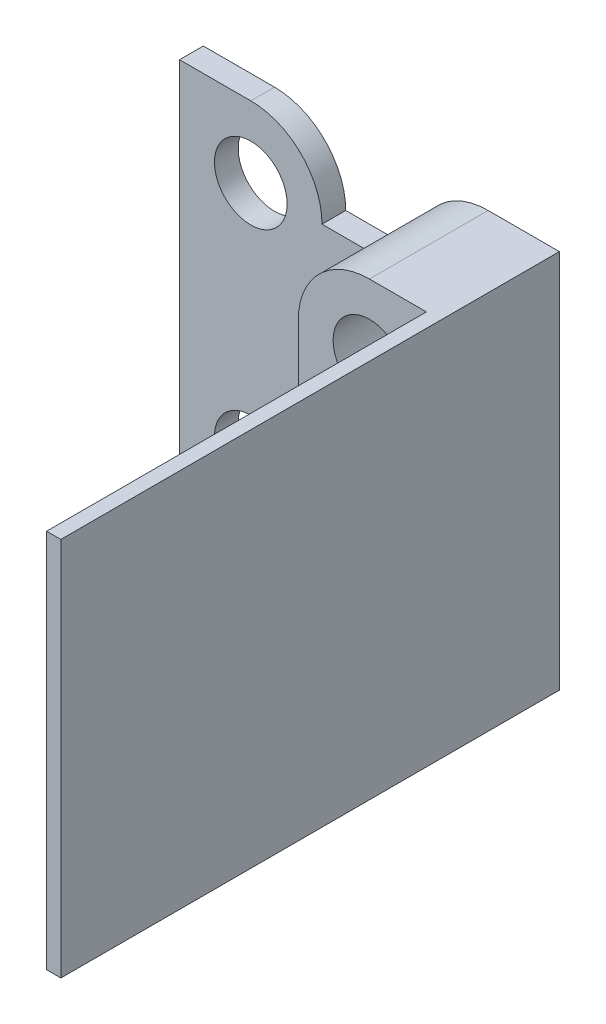
ISO-10303-21;
HEADER;
FILE_DESCRIPTION(('STEP AP214'),'2;1');
FILE_NAME('part.step','',(''),(''),'','','');
FILE_SCHEMA(('AUTOMOTIVE_DESIGN { 1 0 10303 214 1 1 1 1 }'));
ENDSEC;
DATA;
#1=APPLICATION_CONTEXT('core data for automotive mechanical design processes');
#2=APPLICATION_PROTOCOL_DEFINITION('international standard','automotive_design',2000,#1);
#3=PRODUCT_CONTEXT('',#1,'mechanical');
#4=PRODUCT('Part','Part','',(#3));
#5=PRODUCT_RELATED_PRODUCT_CATEGORY('part','',(#4));
#6=PRODUCT_DEFINITION_FORMATION('','',#4);
#7=PRODUCT_DEFINITION_CONTEXT('part definition',#1,'design');
#8=PRODUCT_DEFINITION('design','',#6,#7);
#9=PRODUCT_DEFINITION_SHAPE('','',#8);
#10=(LENGTH_UNIT() NAMED_UNIT(*) SI_UNIT(.MILLI.,.METRE.));
#11=(NAMED_UNIT(*) PLANE_ANGLE_UNIT() SI_UNIT($,.RADIAN.));
#12=(NAMED_UNIT(*) SI_UNIT($,.STERADIAN.) SOLID_ANGLE_UNIT());
#13=UNCERTAINTY_MEASURE_WITH_UNIT(LENGTH_MEASURE(1.E-05),#10,'distance_accuracy_value','');
#14=(GEOMETRIC_REPRESENTATION_CONTEXT(3) GLOBAL_UNCERTAINTY_ASSIGNED_CONTEXT((#13)) GLOBAL_UNIT_ASSIGNED_CONTEXT((#10,
#11,#12)) REPRESENTATION_CONTEXT('',''));
#15=CARTESIAN_POINT('',(0.,0.,0.));
#16=DIRECTION('',(0.,0.,1.));
#17=DIRECTION('',(1.,0.,0.));
#18=AXIS2_PLACEMENT_3D('',#15,#16,#17);
#19=CARTESIAN_POINT('',(45.,50.,5.));
#20=DIRECTION('',(0.,0.,1.));
#21=DIRECTION('',(1.,0.,0.));
#22=AXIS2_PLACEMENT_3D('',#19,#20,#21);
#23=PLANE('',#22);
#24=CARTESIAN_POINT('',(0.,50.,5.));
#25=DIRECTION('',(0.,0.,1.));
#26=DIRECTION('',(1.,0.,0.));
#27=AXIS2_PLACEMENT_3D('',#24,#25,#26);
#28=CIRCLE('',#27,7.65);
#29=CARTESIAN_POINT('',(7.65,50.,5.));
#30=VERTEX_POINT('',#29);
#31=EDGE_CURVE('E172',#30,#30,#28,.T.);
#32=ORIENTED_EDGE('',*,*,#31,.F.);
#33=EDGE_LOOP('',(#32));
#34=FACE_BOUND('',#33,.T.);
#35=CARTESIAN_POINT('',(0.,0.,5.));
#36=DIRECTION('',(0.,0.,1.));
#37=DIRECTION('',(1.,0.,0.));
#38=AXIS2_PLACEMENT_3D('',#35,#36,#37);
#39=CIRCLE('',#38,7.65);
#40=CARTESIAN_POINT('',(7.65,0.,5.));
#41=VERTEX_POINT('',#40);
#42=EDGE_CURVE('E181',#41,#41,#39,.T.);
#43=ORIENTED_EDGE('',*,*,#42,.F.);
#44=EDGE_LOOP('',(#43));
#45=FACE_BOUND('',#44,.T.);
#46=DIRECTION('',(1.,0.,0.));
#47=VECTOR('',#46,1.);
#48=CARTESIAN_POINT('',(30.,35.,5.));
#49=LINE('',#48,#47);
#50=CARTESIAN_POINT('',(30.,35.,5.));
#51=VERTEX_POINT('',#50);
#52=CARTESIAN_POINT('',(57.,35.,5.));
#53=VERTEX_POINT('',#52);
#54=EDGE_CURVE('E48',#51,#53,#49,.T.);
#55=ORIENTED_EDGE('',*,*,#54,.F.);
#56=DIRECTION('',(0.,-1.,0.));
#57=VECTOR('',#56,1.);
#58=CARTESIAN_POINT('',(30.,50.,5.));
#59=LINE('',#58,#57);
#60=CARTESIAN_POINT('',(30.,50.,5.));
#61=VERTEX_POINT('',#60);
#62=EDGE_CURVE('E255',#61,#51,#59,.T.);
#63=ORIENTED_EDGE('',*,*,#62,.F.);
#64=DIRECTION('',(-1.,0.,0.));
#65=VECTOR('',#64,1.);
#66=CARTESIAN_POINT('',(15.,50.,5.));
#67=LINE('',#66,#65);
#68=CARTESIAN_POINT('',(15.,50.,5.));
#69=VERTEX_POINT('',#68);
#70=EDGE_CURVE('E187',#61,#69,#67,.T.);
#71=ORIENTED_EDGE('',*,*,#70,.T.);
#72=CARTESIAN_POINT('',(0.,50.,5.));
#73=DIRECTION('',(0.,0.,1.));
#74=DIRECTION('',(-1.,0.,0.));
#75=AXIS2_PLACEMENT_3D('',#72,#73,#74);
#76=CIRCLE('',#75,15.);
#77=CARTESIAN_POINT('',(0.,65.,5.));
#78=VERTEX_POINT('',#77);
#79=EDGE_CURVE('E189',#69,#78,#76,.T.);
#80=ORIENTED_EDGE('',*,*,#79,.T.);
#81=DIRECTION('',(-1.,0.,0.));
#82=VECTOR('',#81,1.);
#83=CARTESIAN_POINT('',(-15.,65.,5.));
#84=LINE('',#83,#82);
#85=CARTESIAN_POINT('',(-15.,65.,5.));
#86=VERTEX_POINT('',#85);
#87=EDGE_CURVE('E192',#78,#86,#84,.T.);
#88=ORIENTED_EDGE('',*,*,#87,.T.);
#89=DIRECTION('',(0.,-1.,0.));
#90=VECTOR('',#89,1.);
#91=CARTESIAN_POINT('',(-15.,-15.,5.));
#92=LINE('',#91,#90);
#93=CARTESIAN_POINT('',(-15.,-15.,5.));
#94=VERTEX_POINT('',#93);
#95=EDGE_CURVE('E194',#86,#94,#92,.T.);
#96=ORIENTED_EDGE('',*,*,#95,.T.);
#97=DIRECTION('',(1.,0.,0.));
#98=VECTOR('',#97,1.);
#99=CARTESIAN_POINT('',(12.6520767005238,-15.,5.));
#100=LINE('',#99,#98);
#101=CARTESIAN_POINT('',(57.,-15.,5.));
#102=VERTEX_POINT('',#101);
#103=EDGE_CURVE('E196',#94,#102,#100,.T.);
#104=ORIENTED_EDGE('',*,*,#103,.T.);
#105=DIRECTION('',(0.,-1.,0.));
#106=VECTOR('',#105,1.);
#107=CARTESIAN_POINT('',(57.,65.,5.));
#108=LINE('',#107,#106);
#109=EDGE_CURVE('E149',#53,#102,#108,.T.);
#110=ORIENTED_EDGE('',*,*,#109,.F.);
#111=EDGE_LOOP('',(#55,#63,#71,#80,#88,#96,#104,#110));
#112=FACE_BOUND('',#111,.T.);
#113=ADVANCED_FACE('F33',(#34,#45,#112),#23,.T.);
#114=CARTESIAN_POINT('',(45.,50.,0.));
#115=DIRECTION('',(0.,0.,1.));
#116=DIRECTION('',(1.,0.,0.));
#117=AXIS2_PLACEMENT_3D('',#114,#115,#116);
#118=PLANE('',#117);
#119=CARTESIAN_POINT('',(45.,50.,0.));
#120=DIRECTION('',(0.,0.,1.));
#121=DIRECTION('',(1.,0.,0.));
#122=AXIS2_PLACEMENT_3D('',#119,#120,#121);
#123=CIRCLE('',#122,15.);
#124=CARTESIAN_POINT('',(45.,65.,0.));
#125=VERTEX_POINT('',#124);
#126=CARTESIAN_POINT('',(30.,50.,0.));
#127=VERTEX_POINT('',#126);
#128=EDGE_CURVE('E184',#125,#127,#123,.T.);
#129=ORIENTED_EDGE('',*,*,#128,.F.);
#130=DIRECTION('',(-1.,0.,0.));
#131=VECTOR('',#130,1.);
#132=CARTESIAN_POINT('',(45.,65.,0.));
#133=LINE('',#132,#131);
#134=CARTESIAN_POINT('',(60.,65.,0.));
#135=VERTEX_POINT('',#134);
#136=EDGE_CURVE('E190',#135,#125,#133,.T.);
#137=ORIENTED_EDGE('',*,*,#136,.F.);
#138=DIRECTION('',(0.,1.,0.));
#139=VECTOR('',#138,1.);
#140=CARTESIAN_POINT('',(60.,65.,0.));
#141=LINE('',#140,#139);
#142=CARTESIAN_POINT('',(60.,-15.,0.));
#143=VERTEX_POINT('',#142);
#144=EDGE_CURVE('E213',#143,#135,#141,.T.);
#145=ORIENTED_EDGE('',*,*,#144,.F.);
#146=DIRECTION('',(1.,0.,0.));
#147=VECTOR('',#146,1.);
#148=CARTESIAN_POINT('',(60.,-15.,0.));
#149=LINE('',#148,#147);
#150=CARTESIAN_POINT('',(-15.,-15.,0.));
#151=VERTEX_POINT('',#150);
#152=EDGE_CURVE('E210',#151,#143,#149,.T.);
#153=ORIENTED_EDGE('',*,*,#152,.F.);
#154=DIRECTION('',(0.,-1.,0.));
#155=VECTOR('',#154,1.);
#156=CARTESIAN_POINT('',(-15.,-15.,0.));
#157=LINE('',#156,#155);
#158=CARTESIAN_POINT('',(-15.,65.,0.));
#159=VERTEX_POINT('',#158);
#160=EDGE_CURVE('E207',#159,#151,#157,.T.);
#161=ORIENTED_EDGE('',*,*,#160,.F.);
#162=DIRECTION('',(-1.,0.,0.));
#163=VECTOR('',#162,1.);
#164=CARTESIAN_POINT('',(-15.,65.,0.));
#165=LINE('',#164,#163);
#166=CARTESIAN_POINT('',(0.,65.,0.));
#167=VERTEX_POINT('',#166);
#168=EDGE_CURVE('E205',#167,#159,#165,.T.);
#169=ORIENTED_EDGE('',*,*,#168,.F.);
#170=CARTESIAN_POINT('',(0.,50.,0.));
#171=DIRECTION('',(0.,0.,1.));
#172=DIRECTION('',(-1.,0.,0.));
#173=AXIS2_PLACEMENT_3D('',#170,#171,#172);
#174=CIRCLE('',#173,15.);
#175=CARTESIAN_POINT('',(15.,50.,0.));
#176=VERTEX_POINT('',#175);
#177=EDGE_CURVE('E203',#176,#167,#174,.T.);
#178=ORIENTED_EDGE('',*,*,#177,.F.);
#179=DIRECTION('',(-1.,0.,0.));
#180=VECTOR('',#179,1.);
#181=CARTESIAN_POINT('',(15.,50.,0.));
#182=LINE('',#181,#180);
#183=EDGE_CURVE('E201',#127,#176,#182,.T.);
#184=ORIENTED_EDGE('',*,*,#183,.F.);
#185=EDGE_LOOP('',(#129,#137,#145,#153,#161,#169,#178,#184));
#186=FACE_BOUND('',#185,.T.);
#187=CARTESIAN_POINT('',(0.,0.,0.));
#188=DIRECTION('',(0.,0.,1.));
#189=DIRECTION('',(1.,0.,0.));
#190=AXIS2_PLACEMENT_3D('',#187,#188,#189);
#191=CIRCLE('',#190,7.65);
#192=CARTESIAN_POINT('',(7.65,0.,0.));
#193=VERTEX_POINT('',#192);
#194=EDGE_CURVE('E180',#193,#193,#191,.T.);
#195=ORIENTED_EDGE('',*,*,#194,.T.);
#196=EDGE_LOOP('',(#195));
#197=FACE_BOUND('',#196,.T.);
#198=CARTESIAN_POINT('',(45.,50.,0.));
#199=DIRECTION('',(0.,0.,1.));
#200=DIRECTION('',(1.,0.,0.));
#201=AXIS2_PLACEMENT_3D('',#198,#199,#200);
#202=CIRCLE('',#201,7.65);
#203=CARTESIAN_POINT('',(52.65,50.,0.));
#204=VERTEX_POINT('',#203);
#205=EDGE_CURVE('E175',#204,#204,#202,.T.);
#206=ORIENTED_EDGE('',*,*,#205,.T.);
#207=EDGE_LOOP('',(#206));
#208=FACE_BOUND('',#207,.T.);
#209=CARTESIAN_POINT('',(0.,50.,0.));
#210=DIRECTION('',(0.,0.,1.));
#211=DIRECTION('',(1.,0.,0.));
#212=AXIS2_PLACEMENT_3D('',#209,#210,#211);
#213=CIRCLE('',#212,7.65);
#214=CARTESIAN_POINT('',(7.65,50.,0.));
#215=VERTEX_POINT('',#214);
#216=EDGE_CURVE('E171',#215,#215,#213,.T.);
#217=ORIENTED_EDGE('',*,*,#216,.T.);
#218=EDGE_LOOP('',(#217));
#219=FACE_BOUND('',#218,.T.);
#220=ADVANCED_FACE('F243',(#186,#197,#208,#219),#118,.F.);
#221=CARTESIAN_POINT('',(45.,50.,5.));
#222=DIRECTION('',(0.,0.,-1.));
#223=DIRECTION('',(-1.,0.,0.));
#224=AXIS2_PLACEMENT_3D('',#221,#222,#223);
#225=CYLINDRICAL_SURFACE('',#224,15.);
#226=ORIENTED_EDGE('',*,*,#128,.T.);
#227=DIRECTION('',(0.,0.,-1.));
#228=VECTOR('',#227,1.);
#229=CARTESIAN_POINT('',(30.,50.,5.));
#230=LINE('',#229,#228);
#231=EDGE_CURVE('E11',#61,#127,#230,.T.);
#232=ORIENTED_EDGE('',*,*,#231,.F.);
#233=DIRECTION('',(0.,0.,-1.));
#234=VECTOR('',#233,1.);
#235=CARTESIAN_POINT('',(30.,50.,25.));
#236=LINE('',#235,#234);
#237=CARTESIAN_POINT('',(30.,50.,25.));
#238=VERTEX_POINT('',#237);
#239=EDGE_CURVE('E130',#238,#61,#236,.T.);
#240=ORIENTED_EDGE('',*,*,#239,.F.);
#241=CARTESIAN_POINT('',(45.,50.,25.));
#242=DIRECTION('',(0.,0.,1.));
#243=DIRECTION('',(1.,0.,0.));
#244=AXIS2_PLACEMENT_3D('',#241,#242,#243);
#245=CIRCLE('',#244,15.);
#246=CARTESIAN_POINT('',(45.,65.,25.));
#247=VERTEX_POINT('',#246);
#248=EDGE_CURVE('E136',#247,#238,#245,.T.);
#249=ORIENTED_EDGE('',*,*,#248,.F.);
#250=DIRECTION('',(0.,0.,-1.));
#251=VECTOR('',#250,1.);
#252=CARTESIAN_POINT('',(45.,65.,5.));
#253=LINE('',#252,#251);
#254=EDGE_CURVE('E199',#247,#125,#253,.T.);
#255=ORIENTED_EDGE('',*,*,#254,.T.);
#256=EDGE_LOOP('',(#226,#232,#240,#249,#255));
#257=FACE_BOUND('',#256,.T.);
#258=ADVANCED_FACE('F35',(#257),#225,.T.);
#259=CARTESIAN_POINT('',(15.,50.,5.));
#260=DIRECTION('',(0.,-1.,0.));
#261=DIRECTION('',(0.,0.,-1.));
#262=AXIS2_PLACEMENT_3D('',#259,#260,#261);
#263=PLANE('',#262);
#264=ORIENTED_EDGE('',*,*,#183,.T.);
#265=DIRECTION('',(0.,0.,-1.));
#266=VECTOR('',#265,1.);
#267=CARTESIAN_POINT('',(15.,50.,5.));
#268=LINE('',#267,#266);
#269=EDGE_CURVE('E41',#69,#176,#268,.T.);
#270=ORIENTED_EDGE('',*,*,#269,.F.);
#271=ORIENTED_EDGE('',*,*,#70,.F.);
#272=ORIENTED_EDGE('',*,*,#231,.T.);
#273=EDGE_LOOP('',(#264,#270,#271,#272));
#274=FACE_BOUND('',#273,.T.);
#275=ADVANCED_FACE('F256',(#274),#263,.F.);
#276=CARTESIAN_POINT('',(0.,50.,5.));
#277=DIRECTION('',(0.,0.,-1.));
#278=DIRECTION('',(-1.,0.,0.));
#279=AXIS2_PLACEMENT_3D('',#276,#277,#278);
#280=CYLINDRICAL_SURFACE('',#279,15.);
#281=ORIENTED_EDGE('',*,*,#177,.T.);
#282=DIRECTION('',(0.,0.,-1.));
#283=VECTOR('',#282,1.);
#284=CARTESIAN_POINT('',(0.,65.,5.));
#285=LINE('',#284,#283);
#286=EDGE_CURVE('E229',#78,#167,#285,.T.);
#287=ORIENTED_EDGE('',*,*,#286,.F.);
#288=ORIENTED_EDGE('',*,*,#79,.F.);
#289=ORIENTED_EDGE('',*,*,#269,.T.);
#290=EDGE_LOOP('',(#281,#287,#288,#289));
#291=FACE_BOUND('',#290,.T.);
#292=ADVANCED_FACE('F236',(#291),#280,.T.);
#293=CARTESIAN_POINT('',(-15.,65.,5.));
#294=DIRECTION('',(0.,-1.,0.));
#295=DIRECTION('',(0.,0.,-1.));
#296=AXIS2_PLACEMENT_3D('',#293,#294,#295);
#297=PLANE('',#296);
#298=ORIENTED_EDGE('',*,*,#168,.T.);
#299=DIRECTION('',(0.,0.,-1.));
#300=VECTOR('',#299,1.);
#301=CARTESIAN_POINT('',(-15.,65.,5.));
#302=LINE('',#301,#300);
#303=EDGE_CURVE('E226',#86,#159,#302,.T.);
#304=ORIENTED_EDGE('',*,*,#303,.F.);
#305=ORIENTED_EDGE('',*,*,#87,.F.);
#306=ORIENTED_EDGE('',*,*,#286,.T.);
#307=EDGE_LOOP('',(#298,#304,#305,#306));
#308=FACE_BOUND('',#307,.T.);
#309=ADVANCED_FACE('F248',(#308),#297,.F.);
#310=CARTESIAN_POINT('',(-15.,-15.,5.));
#311=DIRECTION('',(1.,0.,0.));
#312=DIRECTION('',(0.,0.,-1.));
#313=AXIS2_PLACEMENT_3D('',#310,#311,#312);
#314=PLANE('',#313);
#315=ORIENTED_EDGE('',*,*,#160,.T.);
#316=DIRECTION('',(0.,0.,-1.));
#317=VECTOR('',#316,1.);
#318=CARTESIAN_POINT('',(-15.,-15.,5.));
#319=LINE('',#318,#317);
#320=EDGE_CURVE('E223',#94,#151,#319,.T.);
#321=ORIENTED_EDGE('',*,*,#320,.F.);
#322=ORIENTED_EDGE('',*,*,#95,.F.);
#323=ORIENTED_EDGE('',*,*,#303,.T.);
#324=EDGE_LOOP('',(#315,#321,#322,#323));
#325=FACE_BOUND('',#324,.T.);
#326=ADVANCED_FACE('F252',(#325),#314,.F.);
#327=CARTESIAN_POINT('',(60.,-15.,5.));
#328=DIRECTION('',(0.,1.,0.));
#329=DIRECTION('',(0.,0.,1.));
#330=AXIS2_PLACEMENT_3D('',#327,#328,#329);
#331=PLANE('',#330);
#332=ORIENTED_EDGE('',*,*,#152,.T.);
#333=DIRECTION('',(0.,0.,-1.));
#334=VECTOR('',#333,1.);
#335=CARTESIAN_POINT('',(60.,-15.,5.));
#336=LINE('',#335,#334);
#337=CARTESIAN_POINT('',(60.,-15.,105.));
#338=VERTEX_POINT('',#337);
#339=EDGE_CURVE('E220',#338,#143,#336,.T.);
#340=ORIENTED_EDGE('',*,*,#339,.F.);
#341=DIRECTION('',(1.,0.,0.));
#342=VECTOR('',#341,1.);
#343=CARTESIAN_POINT('',(60.,-15.,105.));
#344=LINE('',#343,#342);
#345=CARTESIAN_POINT('',(57.,-15.,105.));
#346=VERTEX_POINT('',#345);
#347=EDGE_CURVE('E163',#346,#338,#344,.T.);
#348=ORIENTED_EDGE('',*,*,#347,.F.);
#349=DIRECTION('',(0.,0.,-1.));
#350=VECTOR('',#349,1.);
#351=CARTESIAN_POINT('',(57.,-15.,105.));
#352=LINE('',#351,#350);
#353=EDGE_CURVE('E165',#346,#102,#352,.T.);
#354=ORIENTED_EDGE('',*,*,#353,.T.);
#355=ORIENTED_EDGE('',*,*,#103,.F.);
#356=ORIENTED_EDGE('',*,*,#320,.T.);
#357=EDGE_LOOP('',(#332,#340,#348,#354,#355,#356));
#358=FACE_BOUND('',#357,.T.);
#359=ADVANCED_FACE('F267',(#358),#331,.F.);
#360=CARTESIAN_POINT('',(60.,65.,5.));
#361=DIRECTION('',(-1.,0.,0.));
#362=DIRECTION('',(0.,-1.,0.));
#363=AXIS2_PLACEMENT_3D('',#360,#361,#362);
#364=PLANE('',#363);
#365=ORIENTED_EDGE('',*,*,#144,.T.);
#366=DIRECTION('',(0.,0.,-1.));
#367=VECTOR('',#366,1.);
#368=CARTESIAN_POINT('',(60.,65.,5.));
#369=LINE('',#368,#367);
#370=CARTESIAN_POINT('',(60.,65.,105.));
#371=VERTEX_POINT('',#370);
#372=EDGE_CURVE('E217',#371,#135,#369,.T.);
#373=ORIENTED_EDGE('',*,*,#372,.F.);
#374=DIRECTION('',(0.,1.,0.));
#375=VECTOR('',#374,1.);
#376=CARTESIAN_POINT('',(60.,65.,105.));
#377=LINE('',#376,#375);
#378=EDGE_CURVE('E151',#338,#371,#377,.T.);
#379=ORIENTED_EDGE('',*,*,#378,.F.);
#380=ORIENTED_EDGE('',*,*,#339,.T.);
#381=EDGE_LOOP('',(#365,#373,#379,#380));
#382=FACE_BOUND('',#381,.T.);
#383=ADVANCED_FACE('F264',(#382),#364,.F.);
#384=CARTESIAN_POINT('',(45.,65.,5.));
#385=DIRECTION('',(0.,-1.,0.));
#386=DIRECTION('',(0.,0.,-1.));
#387=AXIS2_PLACEMENT_3D('',#384,#385,#386);
#388=PLANE('',#387);
#389=ORIENTED_EDGE('',*,*,#254,.F.);
#390=DIRECTION('',(-1.,0.,0.));
#391=VECTOR('',#390,1.);
#392=CARTESIAN_POINT('',(57.,65.,25.));
#393=LINE('',#392,#391);
#394=CARTESIAN_POINT('',(57.,65.,25.));
#395=VERTEX_POINT('',#394);
#396=EDGE_CURVE('E143',#395,#247,#393,.T.);
#397=ORIENTED_EDGE('',*,*,#396,.F.);
#398=DIRECTION('',(0.,0.,-1.));
#399=VECTOR('',#398,1.);
#400=CARTESIAN_POINT('',(57.,65.,105.));
#401=LINE('',#400,#399);
#402=CARTESIAN_POINT('',(57.,65.,105.));
#403=VERTEX_POINT('',#402);
#404=EDGE_CURVE('E169',#403,#395,#401,.T.);
#405=ORIENTED_EDGE('',*,*,#404,.F.);
#406=DIRECTION('',(-1.,0.,0.));
#407=VECTOR('',#406,1.);
#408=CARTESIAN_POINT('',(60.,65.,105.));
#409=LINE('',#408,#407);
#410=EDGE_CURVE('E159',#371,#403,#409,.T.);
#411=ORIENTED_EDGE('',*,*,#410,.F.);
#412=ORIENTED_EDGE('',*,*,#372,.T.);
#413=ORIENTED_EDGE('',*,*,#136,.T.);
#414=EDGE_LOOP('',(#389,#397,#405,#411,#412,#413));
#415=FACE_BOUND('',#414,.T.);
#416=ADVANCED_FACE('F259',(#415),#388,.F.);
#417=CARTESIAN_POINT('',(0.,0.,5.));
#418=DIRECTION('',(0.,0.,-1.));
#419=DIRECTION('',(-1.,0.,0.));
#420=AXIS2_PLACEMENT_3D('',#417,#418,#419);
#421=CYLINDRICAL_SURFACE('',#420,7.65);
#422=ORIENTED_EDGE('',*,*,#42,.T.);
#423=EDGE_LOOP('',(#422));
#424=FACE_BOUND('',#423,.T.);
#425=ORIENTED_EDGE('',*,*,#194,.F.);
#426=EDGE_LOOP('',(#425));
#427=FACE_BOUND('',#426,.T.);
#428=ADVANCED_FACE('F306',(#424,#427),#421,.F.);
#429=CARTESIAN_POINT('',(45.,50.,5.));
#430=DIRECTION('',(0.,0.,-1.));
#431=DIRECTION('',(-1.,0.,0.));
#432=AXIS2_PLACEMENT_3D('',#429,#430,#431);
#433=CYLINDRICAL_SURFACE('',#432,7.65);
#434=ORIENTED_EDGE('',*,*,#205,.F.);
#435=EDGE_LOOP('',(#434));
#436=FACE_BOUND('',#435,.T.);
#437=CARTESIAN_POINT('',(45.,50.,25.));
#438=DIRECTION('',(0.,0.,1.));
#439=DIRECTION('',(1.,0.,0.));
#440=AXIS2_PLACEMENT_3D('',#437,#438,#439);
#441=CIRCLE('',#440,7.65);
#442=CARTESIAN_POINT('',(52.65,50.,25.));
#443=VERTEX_POINT('',#442);
#444=EDGE_CURVE('E277',#443,#443,#441,.T.);
#445=ORIENTED_EDGE('',*,*,#444,.T.);
#446=EDGE_LOOP('',(#445));
#447=FACE_BOUND('',#446,.T.);
#448=ADVANCED_FACE('F286',(#436,#447),#433,.F.);
#449=CARTESIAN_POINT('',(0.,50.,5.));
#450=DIRECTION('',(0.,0.,-1.));
#451=DIRECTION('',(-1.,0.,0.));
#452=AXIS2_PLACEMENT_3D('',#449,#450,#451);
#453=CYLINDRICAL_SURFACE('',#452,7.65);
#454=ORIENTED_EDGE('',*,*,#31,.T.);
#455=EDGE_LOOP('',(#454));
#456=FACE_BOUND('',#455,.T.);
#457=ORIENTED_EDGE('',*,*,#216,.F.);
#458=EDGE_LOOP('',(#457));
#459=FACE_BOUND('',#458,.T.);
#460=ADVANCED_FACE('F367',(#456,#459),#453,.F.);
#461=CARTESIAN_POINT('',(57.,65.,105.));
#462=DIRECTION('',(1.,0.,0.));
#463=DIRECTION('',(0.,1.,0.));
#464=AXIS2_PLACEMENT_3D('',#461,#462,#463);
#465=PLANE('',#464);
#466=ORIENTED_EDGE('',*,*,#404,.T.);
#467=DIRECTION('',(0.,1.,0.));
#468=VECTOR('',#467,1.);
#469=CARTESIAN_POINT('',(57.,35.,25.));
#470=LINE('',#469,#468);
#471=CARTESIAN_POINT('',(57.,35.,25.));
#472=VERTEX_POINT('',#471);
#473=EDGE_CURVE('E56',#472,#395,#470,.T.);
#474=ORIENTED_EDGE('',*,*,#473,.F.);
#475=DIRECTION('',(0.,0.,-1.));
#476=VECTOR('',#475,1.);
#477=CARTESIAN_POINT('',(57.,35.,25.));
#478=LINE('',#477,#476);
#479=EDGE_CURVE('E153',#472,#53,#478,.T.);
#480=ORIENTED_EDGE('',*,*,#479,.T.);
#481=ORIENTED_EDGE('',*,*,#109,.T.);
#482=ORIENTED_EDGE('',*,*,#353,.F.);
#483=DIRECTION('',(0.,-1.,0.));
#484=VECTOR('',#483,1.);
#485=CARTESIAN_POINT('',(57.,65.,105.));
#486=LINE('',#485,#484);
#487=EDGE_CURVE('E161',#403,#346,#486,.T.);
#488=ORIENTED_EDGE('',*,*,#487,.F.);
#489=EDGE_LOOP('',(#466,#474,#480,#481,#482,#488));
#490=FACE_BOUND('',#489,.T.);
#491=ADVANCED_FACE('F272',(#490),#465,.F.);
#492=CARTESIAN_POINT('',(0.,0.,105.));
#493=DIRECTION('',(0.,0.,-1.));
#494=DIRECTION('',(-1.,0.,0.));
#495=AXIS2_PLACEMENT_3D('',#492,#493,#494);
#496=PLANE('',#495);
#497=ORIENTED_EDGE('',*,*,#378,.T.);
#498=ORIENTED_EDGE('',*,*,#410,.T.);
#499=ORIENTED_EDGE('',*,*,#487,.T.);
#500=ORIENTED_EDGE('',*,*,#347,.T.);
#501=EDGE_LOOP('',(#497,#498,#499,#500));
#502=FACE_BOUND('',#501,.T.);
#503=ADVANCED_FACE('F269',(#502),#496,.F.);
#504=CARTESIAN_POINT('',(45.,50.,25.));
#505=DIRECTION('',(0.,0.,1.));
#506=DIRECTION('',(1.,0.,0.));
#507=AXIS2_PLACEMENT_3D('',#504,#505,#506);
#508=PLANE('',#507);
#509=ORIENTED_EDGE('',*,*,#248,.T.);
#510=DIRECTION('',(0.,-1.,0.));
#511=VECTOR('',#510,1.);
#512=CARTESIAN_POINT('',(30.,50.,25.));
#513=LINE('',#512,#511);
#514=CARTESIAN_POINT('',(30.,35.,25.));
#515=VERTEX_POINT('',#514);
#516=EDGE_CURVE('E126',#238,#515,#513,.T.);
#517=ORIENTED_EDGE('',*,*,#516,.T.);
#518=DIRECTION('',(1.,0.,0.));
#519=VECTOR('',#518,1.);
#520=CARTESIAN_POINT('',(30.,35.,25.));
#521=LINE('',#520,#519);
#522=EDGE_CURVE('E135',#515,#472,#521,.T.);
#523=ORIENTED_EDGE('',*,*,#522,.T.);
#524=ORIENTED_EDGE('',*,*,#473,.T.);
#525=ORIENTED_EDGE('',*,*,#396,.T.);
#526=EDGE_LOOP('',(#509,#517,#523,#524,#525));
#527=FACE_BOUND('',#526,.T.);
#528=ORIENTED_EDGE('',*,*,#444,.F.);
#529=EDGE_LOOP('',(#528));
#530=FACE_BOUND('',#529,.T.);
#531=ADVANCED_FACE('F140',(#527,#530),#508,.T.);
#532=CARTESIAN_POINT('',(30.,50.,25.));
#533=DIRECTION('',(1.,0.,0.));
#534=DIRECTION('',(0.,0.,-1.));
#535=AXIS2_PLACEMENT_3D('',#532,#533,#534);
#536=PLANE('',#535);
#537=ORIENTED_EDGE('',*,*,#62,.T.);
#538=DIRECTION('',(0.,0.,-1.));
#539=VECTOR('',#538,1.);
#540=CARTESIAN_POINT('',(30.,35.,25.));
#541=LINE('',#540,#539);
#542=EDGE_CURVE('E132',#515,#51,#541,.T.);
#543=ORIENTED_EDGE('',*,*,#542,.F.);
#544=ORIENTED_EDGE('',*,*,#516,.F.);
#545=ORIENTED_EDGE('',*,*,#239,.T.);
#546=EDGE_LOOP('',(#537,#543,#544,#545));
#547=FACE_BOUND('',#546,.T.);
#548=ADVANCED_FACE('F128',(#547),#536,.F.);
#549=CARTESIAN_POINT('',(30.,35.,25.));
#550=DIRECTION('',(0.,1.,0.));
#551=DIRECTION('',(0.,0.,1.));
#552=AXIS2_PLACEMENT_3D('',#549,#550,#551);
#553=PLANE('',#552);
#554=ORIENTED_EDGE('',*,*,#54,.T.);
#555=ORIENTED_EDGE('',*,*,#479,.F.);
#556=ORIENTED_EDGE('',*,*,#522,.F.);
#557=ORIENTED_EDGE('',*,*,#542,.T.);
#558=EDGE_LOOP('',(#554,#555,#556,#557));
#559=FACE_BOUND('',#558,.T.);
#560=ADVANCED_FACE('F275',(#559),#553,.F.);
#561=CLOSED_SHELL('',(#113,#220,#258,#275,#292,#309,#326,#359,#383,#416,#428,#448,#460,#491,
#503,#531,#548,#560));
#562=MANIFOLD_SOLID_BREP('B2',#561);
#563=ADVANCED_BREP_SHAPE_REPRESENTATION('',(#18,#562),#14);
#564=SHAPE_DEFINITION_REPRESENTATION(#9,#563);
ENDSEC;
END-ISO-10303-21;
